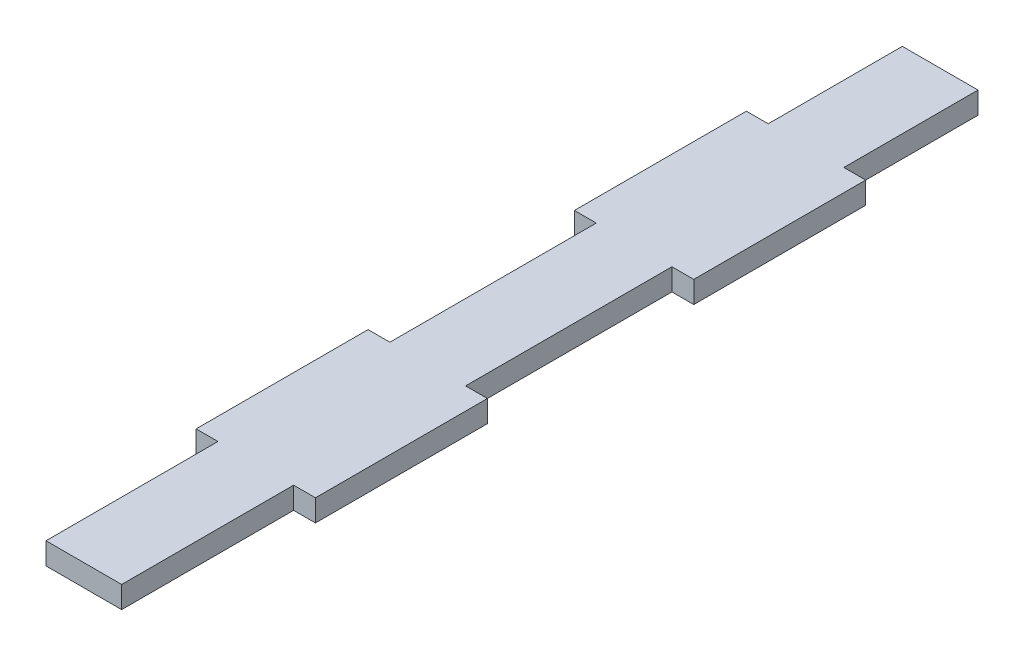
ISO-10303-21;
HEADER;
FILE_DESCRIPTION(('STEP AP214'),'2;1');
FILE_NAME('part.step','',(''),(''),'','','');
FILE_SCHEMA(('AUTOMOTIVE_DESIGN { 1 0 10303 214 1 1 1 1 }'));
ENDSEC;
DATA;
#1=APPLICATION_CONTEXT('core data for automotive mechanical design processes');
#2=APPLICATION_PROTOCOL_DEFINITION('international standard','automotive_design',2000,#1);
#3=PRODUCT_CONTEXT('',#1,'mechanical');
#4=PRODUCT('Part','Part','',(#3));
#5=PRODUCT_RELATED_PRODUCT_CATEGORY('part','',(#4));
#6=PRODUCT_DEFINITION_FORMATION('','',#4);
#7=PRODUCT_DEFINITION_CONTEXT('part definition',#1,'design');
#8=PRODUCT_DEFINITION('design','',#6,#7);
#9=PRODUCT_DEFINITION_SHAPE('','',#8);
#10=(LENGTH_UNIT() NAMED_UNIT(*) SI_UNIT(.MILLI.,.METRE.));
#11=(NAMED_UNIT(*) PLANE_ANGLE_UNIT() SI_UNIT($,.RADIAN.));
#12=(NAMED_UNIT(*) SI_UNIT($,.STERADIAN.) SOLID_ANGLE_UNIT());
#13=UNCERTAINTY_MEASURE_WITH_UNIT(LENGTH_MEASURE(1.E-05),#10,'distance_accuracy_value','');
#14=(GEOMETRIC_REPRESENTATION_CONTEXT(3) GLOBAL_UNCERTAINTY_ASSIGNED_CONTEXT((#13)) GLOBAL_UNIT_ASSIGNED_CONTEXT((#10,
#11,#12)) REPRESENTATION_CONTEXT('',''));
#15=CARTESIAN_POINT('',(0.,0.,0.));
#16=DIRECTION('',(0.,0.,1.));
#17=DIRECTION('',(1.,0.,0.));
#18=AXIS2_PLACEMENT_3D('',#15,#16,#17);
#19=CARTESIAN_POINT('',(0.,6.35,0.));
#20=DIRECTION('',(1.,0.,0.));
#21=DIRECTION('',(0.,0.,-1.));
#22=AXIS2_PLACEMENT_3D('',#19,#20,#21);
#23=PLANE('',#22);
#24=DIRECTION('',(0.,0.,1.));
#25=VECTOR('',#24,1.);
#26=CARTESIAN_POINT('',(0.,0.,0.));
#27=LINE('',#26,#25);
#28=CARTESIAN_POINT('',(0.,0.,-50.));
#29=VERTEX_POINT('',#28);
#30=CARTESIAN_POINT('',(0.,0.,0.));
#31=VERTEX_POINT('',#30);
#32=EDGE_CURVE('E212',#29,#31,#27,.T.);
#33=ORIENTED_EDGE('',*,*,#32,.T.);
#34=DIRECTION('',(0.,-1.,0.));
#35=VECTOR('',#34,1.);
#36=CARTESIAN_POINT('',(0.,6.35,0.));
#37=LINE('',#36,#35);
#38=CARTESIAN_POINT('',(0.,6.35,0.));
#39=VERTEX_POINT('',#38);
#40=EDGE_CURVE('E11',#39,#31,#37,.T.);
#41=ORIENTED_EDGE('',*,*,#40,.F.);
#42=DIRECTION('',(0.,0.,1.));
#43=VECTOR('',#42,1.);
#44=CARTESIAN_POINT('',(0.,6.35,0.));
#45=LINE('',#44,#43);
#46=CARTESIAN_POINT('',(0.,6.35,-50.));
#47=VERTEX_POINT('',#46);
#48=EDGE_CURVE('E270',#47,#39,#45,.T.);
#49=ORIENTED_EDGE('',*,*,#48,.F.);
#50=DIRECTION('',(0.,-1.,0.));
#51=VECTOR('',#50,1.);
#52=CARTESIAN_POINT('',(0.,6.35,-50.));
#53=LINE('',#52,#51);
#54=EDGE_CURVE('E208',#47,#29,#53,.T.);
#55=ORIENTED_EDGE('',*,*,#54,.T.);
#56=EDGE_LOOP('',(#33,#41,#49,#55));
#57=FACE_BOUND('',#56,.T.);
#58=ADVANCED_FACE('F39',(#57),#23,.F.);
#59=CARTESIAN_POINT('',(0.,6.35,0.));
#60=DIRECTION('',(0.,0.,-1.));
#61=DIRECTION('',(-1.,0.,0.));
#62=AXIS2_PLACEMENT_3D('',#59,#60,#61);
#63=PLANE('',#62);
#64=DIRECTION('',(1.,0.,0.));
#65=VECTOR('',#64,1.);
#66=CARTESIAN_POINT('',(0.,0.,0.));
#67=LINE('',#66,#65);
#68=CARTESIAN_POINT('',(22.,0.,0.));
#69=VERTEX_POINT('',#68);
#70=EDGE_CURVE('E216',#31,#69,#67,.T.);
#71=ORIENTED_EDGE('',*,*,#70,.T.);
#72=DIRECTION('',(0.,-1.,0.));
#73=VECTOR('',#72,1.);
#74=CARTESIAN_POINT('',(22.,6.35,0.));
#75=LINE('',#74,#73);
#76=CARTESIAN_POINT('',(22.,6.35,0.));
#77=VERTEX_POINT('',#76);
#78=EDGE_CURVE('E48',#77,#69,#75,.T.);
#79=ORIENTED_EDGE('',*,*,#78,.F.);
#80=DIRECTION('',(1.,0.,0.));
#81=VECTOR('',#80,1.);
#82=CARTESIAN_POINT('',(0.,6.35,0.));
#83=LINE('',#82,#81);
#84=EDGE_CURVE('E135',#39,#77,#83,.T.);
#85=ORIENTED_EDGE('',*,*,#84,.F.);
#86=ORIENTED_EDGE('',*,*,#40,.T.);
#87=EDGE_LOOP('',(#71,#79,#85,#86));
#88=FACE_BOUND('',#87,.T.);
#89=ADVANCED_FACE('F420',(#88),#63,.F.);
#90=CARTESIAN_POINT('',(22.,6.35,0.));
#91=DIRECTION('',(-1.,0.,0.));
#92=DIRECTION('',(0.,0.,1.));
#93=AXIS2_PLACEMENT_3D('',#90,#91,#92);
#94=PLANE('',#93);
#95=DIRECTION('',(0.,0.,-1.));
#96=VECTOR('',#95,1.);
#97=CARTESIAN_POINT('',(22.,0.,0.));
#98=LINE('',#97,#96);
#99=CARTESIAN_POINT('',(22.,0.,-50.));
#100=VERTEX_POINT('',#99);
#101=EDGE_CURVE('E219',#69,#100,#98,.T.);
#102=ORIENTED_EDGE('',*,*,#101,.T.);
#103=DIRECTION('',(0.,-1.,0.));
#104=VECTOR('',#103,1.);
#105=CARTESIAN_POINT('',(22.,6.35,-50.));
#106=LINE('',#105,#104);
#107=CARTESIAN_POINT('',(22.,6.35,-50.));
#108=VERTEX_POINT('',#107);
#109=EDGE_CURVE('E329',#108,#100,#106,.T.);
#110=ORIENTED_EDGE('',*,*,#109,.F.);
#111=DIRECTION('',(0.,0.,-1.));
#112=VECTOR('',#111,1.);
#113=CARTESIAN_POINT('',(22.,6.35,0.));
#114=LINE('',#113,#112);
#115=EDGE_CURVE('E339',#77,#108,#114,.T.);
#116=ORIENTED_EDGE('',*,*,#115,.F.);
#117=ORIENTED_EDGE('',*,*,#78,.T.);
#118=EDGE_LOOP('',(#102,#110,#116,#117));
#119=FACE_BOUND('',#118,.T.);
#120=ADVANCED_FACE('F337',(#119),#94,.F.);
#121=CARTESIAN_POINT('',(22.,6.35,-50.));
#122=DIRECTION('',(0.,0.,-1.));
#123=DIRECTION('',(-1.,0.,0.));
#124=AXIS2_PLACEMENT_3D('',#121,#122,#123);
#125=PLANE('',#124);
#126=DIRECTION('',(1.,0.,0.));
#127=VECTOR('',#126,1.);
#128=CARTESIAN_POINT('',(22.,0.,-50.));
#129=LINE('',#128,#127);
#130=CARTESIAN_POINT('',(28.35,0.,-50.));
#131=VERTEX_POINT('',#130);
#132=EDGE_CURVE('E222',#100,#131,#129,.T.);
#133=ORIENTED_EDGE('',*,*,#132,.T.);
#134=DIRECTION('',(0.,-1.,0.));
#135=VECTOR('',#134,1.);
#136=CARTESIAN_POINT('',(28.35,6.35,-50.));
#137=LINE('',#136,#135);
#138=CARTESIAN_POINT('',(28.35,6.35,-50.));
#139=VERTEX_POINT('',#138);
#140=EDGE_CURVE('E325',#139,#131,#137,.T.);
#141=ORIENTED_EDGE('',*,*,#140,.F.);
#142=DIRECTION('',(1.,0.,0.));
#143=VECTOR('',#142,1.);
#144=CARTESIAN_POINT('',(22.,6.35,-50.));
#145=LINE('',#144,#143);
#146=EDGE_CURVE('E358',#108,#139,#145,.T.);
#147=ORIENTED_EDGE('',*,*,#146,.F.);
#148=ORIENTED_EDGE('',*,*,#109,.T.);
#149=EDGE_LOOP('',(#133,#141,#147,#148));
#150=FACE_BOUND('',#149,.T.);
#151=ADVANCED_FACE('F348',(#150),#125,.F.);
#152=CARTESIAN_POINT('',(28.35,6.35,-50.));
#153=DIRECTION('',(-1.,0.,0.));
#154=DIRECTION('',(0.,0.,1.));
#155=AXIS2_PLACEMENT_3D('',#152,#153,#154);
#156=PLANE('',#155);
#157=DIRECTION('',(0.,0.,-1.));
#158=VECTOR('',#157,1.);
#159=CARTESIAN_POINT('',(28.35,0.,-50.));
#160=LINE('',#159,#158);
#161=CARTESIAN_POINT('',(28.35,0.,-100.));
#162=VERTEX_POINT('',#161);
#163=EDGE_CURVE('E225',#131,#162,#160,.T.);
#164=ORIENTED_EDGE('',*,*,#163,.T.);
#165=DIRECTION('',(0.,-1.,0.));
#166=VECTOR('',#165,1.);
#167=CARTESIAN_POINT('',(28.35,6.35,-100.));
#168=LINE('',#167,#166);
#169=CARTESIAN_POINT('',(28.35,6.35,-100.));
#170=VERTEX_POINT('',#169);
#171=EDGE_CURVE('E321',#170,#162,#168,.T.);
#172=ORIENTED_EDGE('',*,*,#171,.F.);
#173=DIRECTION('',(0.,0.,-1.));
#174=VECTOR('',#173,1.);
#175=CARTESIAN_POINT('',(28.35,6.35,-50.));
#176=LINE('',#175,#174);
#177=EDGE_CURVE('E354',#139,#170,#176,.T.);
#178=ORIENTED_EDGE('',*,*,#177,.F.);
#179=ORIENTED_EDGE('',*,*,#140,.T.);
#180=EDGE_LOOP('',(#164,#172,#178,#179));
#181=FACE_BOUND('',#180,.T.);
#182=ADVANCED_FACE('F352',(#181),#156,.F.);
#183=CARTESIAN_POINT('',(22.,6.35,-100.));
#184=DIRECTION('',(0.,0.,1.));
#185=DIRECTION('',(1.,0.,0.));
#186=AXIS2_PLACEMENT_3D('',#183,#184,#185);
#187=PLANE('',#186);
#188=DIRECTION('',(-1.,0.,0.));
#189=VECTOR('',#188,1.);
#190=CARTESIAN_POINT('',(22.,0.,-100.));
#191=LINE('',#190,#189);
#192=CARTESIAN_POINT('',(22.,0.,-100.));
#193=VERTEX_POINT('',#192);
#194=EDGE_CURVE('E228',#162,#193,#191,.T.);
#195=ORIENTED_EDGE('',*,*,#194,.T.);
#196=DIRECTION('',(0.,-1.,0.));
#197=VECTOR('',#196,1.);
#198=CARTESIAN_POINT('',(22.,6.35,-100.));
#199=LINE('',#198,#197);
#200=CARTESIAN_POINT('',(22.,6.35,-100.));
#201=VERTEX_POINT('',#200);
#202=EDGE_CURVE('E317',#201,#193,#199,.T.);
#203=ORIENTED_EDGE('',*,*,#202,.F.);
#204=DIRECTION('',(-1.,0.,0.));
#205=VECTOR('',#204,1.);
#206=CARTESIAN_POINT('',(22.,6.35,-100.));
#207=LINE('',#206,#205);
#208=EDGE_CURVE('E357',#170,#201,#207,.T.);
#209=ORIENTED_EDGE('',*,*,#208,.F.);
#210=ORIENTED_EDGE('',*,*,#171,.T.);
#211=EDGE_LOOP('',(#195,#203,#209,#210));
#212=FACE_BOUND('',#211,.T.);
#213=ADVANCED_FACE('F433',(#212),#187,.F.);
#214=CARTESIAN_POINT('',(22.,6.35,-100.));
#215=DIRECTION('',(-1.,0.,0.));
#216=DIRECTION('',(0.,0.,1.));
#217=AXIS2_PLACEMENT_3D('',#214,#215,#216);
#218=PLANE('',#217);
#219=DIRECTION('',(0.,0.,-1.));
#220=VECTOR('',#219,1.);
#221=CARTESIAN_POINT('',(22.,0.,-100.));
#222=LINE('',#221,#220);
#223=CARTESIAN_POINT('',(22.,0.,-160.));
#224=VERTEX_POINT('',#223);
#225=EDGE_CURVE('E231',#193,#224,#222,.T.);
#226=ORIENTED_EDGE('',*,*,#225,.T.);
#227=DIRECTION('',(0.,-1.,0.));
#228=VECTOR('',#227,1.);
#229=CARTESIAN_POINT('',(22.,6.35,-160.));
#230=LINE('',#229,#228);
#231=CARTESIAN_POINT('',(22.,6.35,-160.));
#232=VERTEX_POINT('',#231);
#233=EDGE_CURVE('E313',#232,#224,#230,.T.);
#234=ORIENTED_EDGE('',*,*,#233,.F.);
#235=DIRECTION('',(0.,0.,-1.));
#236=VECTOR('',#235,1.);
#237=CARTESIAN_POINT('',(22.,6.35,-100.));
#238=LINE('',#237,#236);
#239=EDGE_CURVE('E362',#201,#232,#238,.T.);
#240=ORIENTED_EDGE('',*,*,#239,.F.);
#241=ORIENTED_EDGE('',*,*,#202,.T.);
#242=EDGE_LOOP('',(#226,#234,#240,#241));
#243=FACE_BOUND('',#242,.T.);
#244=ADVANCED_FACE('F436',(#243),#218,.F.);
#245=CARTESIAN_POINT('',(22.,6.35,-160.));
#246=DIRECTION('',(0.,0.,-1.));
#247=DIRECTION('',(-1.,0.,0.));
#248=AXIS2_PLACEMENT_3D('',#245,#246,#247);
#249=PLANE('',#248);
#250=DIRECTION('',(1.,0.,0.));
#251=VECTOR('',#250,1.);
#252=CARTESIAN_POINT('',(22.,0.,-160.));
#253=LINE('',#252,#251);
#254=CARTESIAN_POINT('',(28.35,0.,-160.));
#255=VERTEX_POINT('',#254);
#256=EDGE_CURVE('E234',#224,#255,#253,.T.);
#257=ORIENTED_EDGE('',*,*,#256,.T.);
#258=DIRECTION('',(0.,-1.,0.));
#259=VECTOR('',#258,1.);
#260=CARTESIAN_POINT('',(28.35,6.35,-160.));
#261=LINE('',#260,#259);
#262=CARTESIAN_POINT('',(28.35,6.35,-160.));
#263=VERTEX_POINT('',#262);
#264=EDGE_CURVE('E309',#263,#255,#261,.T.);
#265=ORIENTED_EDGE('',*,*,#264,.F.);
#266=DIRECTION('',(1.,0.,0.));
#267=VECTOR('',#266,1.);
#268=CARTESIAN_POINT('',(22.,6.35,-160.));
#269=LINE('',#268,#267);
#270=EDGE_CURVE('E369',#232,#263,#269,.T.);
#271=ORIENTED_EDGE('',*,*,#270,.F.);
#272=ORIENTED_EDGE('',*,*,#233,.T.);
#273=EDGE_LOOP('',(#257,#265,#271,#272));
#274=FACE_BOUND('',#273,.T.);
#275=ADVANCED_FACE('F440',(#274),#249,.F.);
#276=CARTESIAN_POINT('',(28.35,6.35,-160.));
#277=DIRECTION('',(-1.,0.,0.));
#278=DIRECTION('',(0.,0.,1.));
#279=AXIS2_PLACEMENT_3D('',#276,#277,#278);
#280=PLANE('',#279);
#281=DIRECTION('',(0.,0.,-1.));
#282=VECTOR('',#281,1.);
#283=CARTESIAN_POINT('',(28.35,0.,-160.));
#284=LINE('',#283,#282);
#285=CARTESIAN_POINT('',(28.35,0.,-210.));
#286=VERTEX_POINT('',#285);
#287=EDGE_CURVE('E237',#255,#286,#284,.T.);
#288=ORIENTED_EDGE('',*,*,#287,.T.);
#289=DIRECTION('',(0.,-1.,0.));
#290=VECTOR('',#289,1.);
#291=CARTESIAN_POINT('',(28.35,6.35,-210.));
#292=LINE('',#291,#290);
#293=CARTESIAN_POINT('',(28.35,6.35,-210.));
#294=VERTEX_POINT('',#293);
#295=EDGE_CURVE('E305',#294,#286,#292,.T.);
#296=ORIENTED_EDGE('',*,*,#295,.F.);
#297=DIRECTION('',(0.,0.,-1.));
#298=VECTOR('',#297,1.);
#299=CARTESIAN_POINT('',(28.35,6.35,-160.));
#300=LINE('',#299,#298);
#301=EDGE_CURVE('E372',#263,#294,#300,.T.);
#302=ORIENTED_EDGE('',*,*,#301,.F.);
#303=ORIENTED_EDGE('',*,*,#264,.T.);
#304=EDGE_LOOP('',(#288,#296,#302,#303));
#305=FACE_BOUND('',#304,.T.);
#306=ADVANCED_FACE('F444',(#305),#280,.F.);
#307=CARTESIAN_POINT('',(22.,6.35,-210.));
#308=DIRECTION('',(0.,0.,1.));
#309=DIRECTION('',(1.,0.,0.));
#310=AXIS2_PLACEMENT_3D('',#307,#308,#309);
#311=PLANE('',#310);
#312=DIRECTION('',(-1.,0.,0.));
#313=VECTOR('',#312,1.);
#314=CARTESIAN_POINT('',(22.,0.,-210.));
#315=LINE('',#314,#313);
#316=CARTESIAN_POINT('',(22.,0.,-210.));
#317=VERTEX_POINT('',#316);
#318=EDGE_CURVE('E240',#286,#317,#315,.T.);
#319=ORIENTED_EDGE('',*,*,#318,.T.);
#320=DIRECTION('',(0.,-1.,0.));
#321=VECTOR('',#320,1.);
#322=CARTESIAN_POINT('',(22.,6.35,-210.));
#323=LINE('',#322,#321);
#324=CARTESIAN_POINT('',(22.,6.35,-210.));
#325=VERTEX_POINT('',#324);
#326=EDGE_CURVE('E301',#325,#317,#323,.T.);
#327=ORIENTED_EDGE('',*,*,#326,.F.);
#328=DIRECTION('',(-1.,0.,0.));
#329=VECTOR('',#328,1.);
#330=CARTESIAN_POINT('',(22.,6.35,-210.));
#331=LINE('',#330,#329);
#332=EDGE_CURVE('E375',#294,#325,#331,.T.);
#333=ORIENTED_EDGE('',*,*,#332,.F.);
#334=ORIENTED_EDGE('',*,*,#295,.T.);
#335=EDGE_LOOP('',(#319,#327,#333,#334));
#336=FACE_BOUND('',#335,.T.);
#337=ADVANCED_FACE('F448',(#336),#311,.F.);
#338=CARTESIAN_POINT('',(22.,6.35,-210.));
#339=DIRECTION('',(-1.,0.,0.));
#340=DIRECTION('',(0.,0.,1.));
#341=AXIS2_PLACEMENT_3D('',#338,#339,#340);
#342=PLANE('',#341);
#343=DIRECTION('',(0.,0.,-1.));
#344=VECTOR('',#343,1.);
#345=CARTESIAN_POINT('',(22.,0.,-210.));
#346=LINE('',#345,#344);
#347=CARTESIAN_POINT('',(22.,0.,-249.));
#348=VERTEX_POINT('',#347);
#349=EDGE_CURVE('E243',#317,#348,#346,.T.);
#350=ORIENTED_EDGE('',*,*,#349,.T.);
#351=DIRECTION('',(0.,-1.,0.));
#352=VECTOR('',#351,1.);
#353=CARTESIAN_POINT('',(22.,6.35,-249.));
#354=LINE('',#353,#352);
#355=CARTESIAN_POINT('',(22.,6.35,-249.));
#356=VERTEX_POINT('',#355);
#357=EDGE_CURVE('E297',#356,#348,#354,.T.);
#358=ORIENTED_EDGE('',*,*,#357,.F.);
#359=DIRECTION('',(0.,0.,-1.));
#360=VECTOR('',#359,1.);
#361=CARTESIAN_POINT('',(22.,6.35,-210.));
#362=LINE('',#361,#360);
#363=EDGE_CURVE('E378',#325,#356,#362,.T.);
#364=ORIENTED_EDGE('',*,*,#363,.F.);
#365=ORIENTED_EDGE('',*,*,#326,.T.);
#366=EDGE_LOOP('',(#350,#358,#364,#365));
#367=FACE_BOUND('',#366,.T.);
#368=ADVANCED_FACE('F452',(#367),#342,.F.);
#369=CARTESIAN_POINT('',(0.,6.35,-249.));
#370=DIRECTION('',(0.,0.,1.));
#371=DIRECTION('',(1.,0.,0.));
#372=AXIS2_PLACEMENT_3D('',#369,#370,#371);
#373=PLANE('',#372);
#374=DIRECTION('',(-1.,0.,0.));
#375=VECTOR('',#374,1.);
#376=CARTESIAN_POINT('',(0.,0.,-249.));
#377=LINE('',#376,#375);
#378=CARTESIAN_POINT('',(0.,0.,-249.));
#379=VERTEX_POINT('',#378);
#380=EDGE_CURVE('E246',#348,#379,#377,.T.);
#381=ORIENTED_EDGE('',*,*,#380,.T.);
#382=DIRECTION('',(0.,-1.,0.));
#383=VECTOR('',#382,1.);
#384=CARTESIAN_POINT('',(0.,6.35,-249.));
#385=LINE('',#384,#383);
#386=CARTESIAN_POINT('',(0.,6.35,-249.));
#387=VERTEX_POINT('',#386);
#388=EDGE_CURVE('E293',#387,#379,#385,.T.);
#389=ORIENTED_EDGE('',*,*,#388,.F.);
#390=DIRECTION('',(-1.,0.,0.));
#391=VECTOR('',#390,1.);
#392=CARTESIAN_POINT('',(0.,6.35,-249.));
#393=LINE('',#392,#391);
#394=EDGE_CURVE('E381',#356,#387,#393,.T.);
#395=ORIENTED_EDGE('',*,*,#394,.F.);
#396=ORIENTED_EDGE('',*,*,#357,.T.);
#397=EDGE_LOOP('',(#381,#389,#395,#396));
#398=FACE_BOUND('',#397,.T.);
#399=ADVANCED_FACE('F456',(#398),#373,.F.);
#400=CARTESIAN_POINT('',(0.,6.35,-210.));
#401=DIRECTION('',(1.,0.,0.));
#402=DIRECTION('',(0.,0.,-1.));
#403=AXIS2_PLACEMENT_3D('',#400,#401,#402);
#404=PLANE('',#403);
#405=DIRECTION('',(0.,0.,1.));
#406=VECTOR('',#405,1.);
#407=CARTESIAN_POINT('',(0.,0.,-210.));
#408=LINE('',#407,#406);
#409=CARTESIAN_POINT('',(0.,0.,-210.));
#410=VERTEX_POINT('',#409);
#411=EDGE_CURVE('E249',#379,#410,#408,.T.);
#412=ORIENTED_EDGE('',*,*,#411,.T.);
#413=DIRECTION('',(0.,-1.,0.));
#414=VECTOR('',#413,1.);
#415=CARTESIAN_POINT('',(0.,6.35,-210.));
#416=LINE('',#415,#414);
#417=CARTESIAN_POINT('',(0.,6.35,-210.));
#418=VERTEX_POINT('',#417);
#419=EDGE_CURVE('E289',#418,#410,#416,.T.);
#420=ORIENTED_EDGE('',*,*,#419,.F.);
#421=DIRECTION('',(0.,0.,1.));
#422=VECTOR('',#421,1.);
#423=CARTESIAN_POINT('',(0.,6.35,-210.));
#424=LINE('',#423,#422);
#425=EDGE_CURVE('E384',#387,#418,#424,.T.);
#426=ORIENTED_EDGE('',*,*,#425,.F.);
#427=ORIENTED_EDGE('',*,*,#388,.T.);
#428=EDGE_LOOP('',(#412,#420,#426,#427));
#429=FACE_BOUND('',#428,.T.);
#430=ADVANCED_FACE('F460',(#429),#404,.F.);
#431=CARTESIAN_POINT('',(0.,6.35,-210.));
#432=DIRECTION('',(0.,0.,1.));
#433=DIRECTION('',(1.,0.,0.));
#434=AXIS2_PLACEMENT_3D('',#431,#432,#433);
#435=PLANE('',#434);
#436=DIRECTION('',(-1.,0.,0.));
#437=VECTOR('',#436,1.);
#438=CARTESIAN_POINT('',(0.,0.,-210.));
#439=LINE('',#438,#437);
#440=CARTESIAN_POINT('',(-6.35,0.,-210.));
#441=VERTEX_POINT('',#440);
#442=EDGE_CURVE('E252',#410,#441,#439,.T.);
#443=ORIENTED_EDGE('',*,*,#442,.T.);
#444=DIRECTION('',(0.,-1.,0.));
#445=VECTOR('',#444,1.);
#446=CARTESIAN_POINT('',(-6.35,6.35,-210.));
#447=LINE('',#446,#445);
#448=CARTESIAN_POINT('',(-6.35,6.35,-210.));
#449=VERTEX_POINT('',#448);
#450=EDGE_CURVE('E285',#449,#441,#447,.T.);
#451=ORIENTED_EDGE('',*,*,#450,.F.);
#452=DIRECTION('',(-1.,0.,0.));
#453=VECTOR('',#452,1.);
#454=CARTESIAN_POINT('',(0.,6.35,-210.));
#455=LINE('',#454,#453);
#456=EDGE_CURVE('E387',#418,#449,#455,.T.);
#457=ORIENTED_EDGE('',*,*,#456,.F.);
#458=ORIENTED_EDGE('',*,*,#419,.T.);
#459=EDGE_LOOP('',(#443,#451,#457,#458));
#460=FACE_BOUND('',#459,.T.);
#461=ADVANCED_FACE('F464',(#460),#435,.F.);
#462=CARTESIAN_POINT('',(-6.35,6.35,-160.));
#463=DIRECTION('',(1.,0.,0.));
#464=DIRECTION('',(0.,0.,-1.));
#465=AXIS2_PLACEMENT_3D('',#462,#463,#464);
#466=PLANE('',#465);
#467=DIRECTION('',(0.,0.,1.));
#468=VECTOR('',#467,1.);
#469=CARTESIAN_POINT('',(-6.35,0.,-160.));
#470=LINE('',#469,#468);
#471=CARTESIAN_POINT('',(-6.35,0.,-160.));
#472=VERTEX_POINT('',#471);
#473=EDGE_CURVE('E255',#441,#472,#470,.T.);
#474=ORIENTED_EDGE('',*,*,#473,.T.);
#475=DIRECTION('',(0.,-1.,0.));
#476=VECTOR('',#475,1.);
#477=CARTESIAN_POINT('',(-6.35,6.35,-160.));
#478=LINE('',#477,#476);
#479=CARTESIAN_POINT('',(-6.35,6.35,-160.));
#480=VERTEX_POINT('',#479);
#481=EDGE_CURVE('E281',#480,#472,#478,.T.);
#482=ORIENTED_EDGE('',*,*,#481,.F.);
#483=DIRECTION('',(0.,0.,1.));
#484=VECTOR('',#483,1.);
#485=CARTESIAN_POINT('',(-6.35,6.35,-160.));
#486=LINE('',#485,#484);
#487=EDGE_CURVE('E390',#449,#480,#486,.T.);
#488=ORIENTED_EDGE('',*,*,#487,.F.);
#489=ORIENTED_EDGE('',*,*,#450,.T.);
#490=EDGE_LOOP('',(#474,#482,#488,#489));
#491=FACE_BOUND('',#490,.T.);
#492=ADVANCED_FACE('F468',(#491),#466,.F.);
#493=CARTESIAN_POINT('',(0.,6.35,-160.));
#494=DIRECTION('',(0.,0.,-1.));
#495=DIRECTION('',(-1.,0.,0.));
#496=AXIS2_PLACEMENT_3D('',#493,#494,#495);
#497=PLANE('',#496);
#498=DIRECTION('',(1.,0.,0.));
#499=VECTOR('',#498,1.);
#500=CARTESIAN_POINT('',(0.,0.,-160.));
#501=LINE('',#500,#499);
#502=CARTESIAN_POINT('',(0.,0.,-160.));
#503=VERTEX_POINT('',#502);
#504=EDGE_CURVE('E258',#472,#503,#501,.T.);
#505=ORIENTED_EDGE('',*,*,#504,.T.);
#506=DIRECTION('',(0.,-1.,0.));
#507=VECTOR('',#506,1.);
#508=CARTESIAN_POINT('',(0.,6.35,-160.));
#509=LINE('',#508,#507);
#510=CARTESIAN_POINT('',(0.,6.35,-160.));
#511=VERTEX_POINT('',#510);
#512=EDGE_CURVE('E277',#511,#503,#509,.T.);
#513=ORIENTED_EDGE('',*,*,#512,.F.);
#514=DIRECTION('',(1.,0.,0.));
#515=VECTOR('',#514,1.);
#516=CARTESIAN_POINT('',(0.,6.35,-160.));
#517=LINE('',#516,#515);
#518=EDGE_CURVE('E393',#480,#511,#517,.T.);
#519=ORIENTED_EDGE('',*,*,#518,.F.);
#520=ORIENTED_EDGE('',*,*,#481,.T.);
#521=EDGE_LOOP('',(#505,#513,#519,#520));
#522=FACE_BOUND('',#521,.T.);
#523=ADVANCED_FACE('F401',(#522),#497,.F.);
#524=CARTESIAN_POINT('',(0.,6.35,-100.));
#525=DIRECTION('',(1.,0.,0.));
#526=DIRECTION('',(0.,0.,-1.));
#527=AXIS2_PLACEMENT_3D('',#524,#525,#526);
#528=PLANE('',#527);
#529=DIRECTION('',(0.,0.,1.));
#530=VECTOR('',#529,1.);
#531=CARTESIAN_POINT('',(0.,0.,-100.));
#532=LINE('',#531,#530);
#533=CARTESIAN_POINT('',(0.,0.,-100.));
#534=VERTEX_POINT('',#533);
#535=EDGE_CURVE('E261',#503,#534,#532,.T.);
#536=ORIENTED_EDGE('',*,*,#535,.T.);
#537=DIRECTION('',(0.,-1.,0.));
#538=VECTOR('',#537,1.);
#539=CARTESIAN_POINT('',(0.,6.35,-100.));
#540=LINE('',#539,#538);
#541=CARTESIAN_POINT('',(0.,6.35,-100.));
#542=VERTEX_POINT('',#541);
#543=EDGE_CURVE('E201',#542,#534,#540,.T.);
#544=ORIENTED_EDGE('',*,*,#543,.F.);
#545=DIRECTION('',(0.,0.,1.));
#546=VECTOR('',#545,1.);
#547=CARTESIAN_POINT('',(0.,6.35,-100.));
#548=LINE('',#547,#546);
#549=EDGE_CURVE('E190',#511,#542,#548,.T.);
#550=ORIENTED_EDGE('',*,*,#549,.F.);
#551=ORIENTED_EDGE('',*,*,#512,.T.);
#552=EDGE_LOOP('',(#536,#544,#550,#551));
#553=FACE_BOUND('',#552,.T.);
#554=ADVANCED_FACE('F405',(#553),#528,.F.);
#555=CARTESIAN_POINT('',(0.,6.35,-100.));
#556=DIRECTION('',(0.,0.,1.));
#557=DIRECTION('',(1.,0.,0.));
#558=AXIS2_PLACEMENT_3D('',#555,#556,#557);
#559=PLANE('',#558);
#560=DIRECTION('',(-1.,0.,0.));
#561=VECTOR('',#560,1.);
#562=CARTESIAN_POINT('',(0.,0.,-100.));
#563=LINE('',#562,#561);
#564=CARTESIAN_POINT('',(-6.35,0.,-100.));
#565=VERTEX_POINT('',#564);
#566=EDGE_CURVE('E199',#534,#565,#563,.T.);
#567=ORIENTED_EDGE('',*,*,#566,.T.);
#568=DIRECTION('',(0.,-1.,0.));
#569=VECTOR('',#568,1.);
#570=CARTESIAN_POINT('',(-6.35,6.35,-100.));
#571=LINE('',#570,#569);
#572=CARTESIAN_POINT('',(-6.35,6.35,-100.));
#573=VERTEX_POINT('',#572);
#574=EDGE_CURVE('E196',#573,#565,#571,.T.);
#575=ORIENTED_EDGE('',*,*,#574,.F.);
#576=DIRECTION('',(-1.,0.,0.));
#577=VECTOR('',#576,1.);
#578=CARTESIAN_POINT('',(0.,6.35,-100.));
#579=LINE('',#578,#577);
#580=EDGE_CURVE('E184',#542,#573,#579,.T.);
#581=ORIENTED_EDGE('',*,*,#580,.F.);
#582=ORIENTED_EDGE('',*,*,#543,.T.);
#583=EDGE_LOOP('',(#567,#575,#581,#582));
#584=FACE_BOUND('',#583,.T.);
#585=ADVANCED_FACE('F197',(#584),#559,.F.);
#586=CARTESIAN_POINT('',(-6.35,6.35,-50.));
#587=DIRECTION('',(1.,0.,0.));
#588=DIRECTION('',(0.,0.,-1.));
#589=AXIS2_PLACEMENT_3D('',#586,#587,#588);
#590=PLANE('',#589);
#591=DIRECTION('',(0.,0.,1.));
#592=VECTOR('',#591,1.);
#593=CARTESIAN_POINT('',(-6.35,0.,-50.));
#594=LINE('',#593,#592);
#595=CARTESIAN_POINT('',(-6.35,0.,-50.));
#596=VERTEX_POINT('',#595);
#597=EDGE_CURVE('E121',#565,#596,#594,.T.);
#598=ORIENTED_EDGE('',*,*,#597,.T.);
#599=DIRECTION('',(0.,-1.,0.));
#600=VECTOR('',#599,1.);
#601=CARTESIAN_POINT('',(-6.35,6.35,-50.));
#602=LINE('',#601,#600);
#603=CARTESIAN_POINT('',(-6.35,6.35,-50.));
#604=VERTEX_POINT('',#603);
#605=EDGE_CURVE('E202',#604,#596,#602,.T.);
#606=ORIENTED_EDGE('',*,*,#605,.F.);
#607=DIRECTION('',(0.,0.,1.));
#608=VECTOR('',#607,1.);
#609=CARTESIAN_POINT('',(-6.35,6.35,-50.));
#610=LINE('',#609,#608);
#611=EDGE_CURVE('E188',#573,#604,#610,.T.);
#612=ORIENTED_EDGE('',*,*,#611,.F.);
#613=ORIENTED_EDGE('',*,*,#574,.T.);
#614=EDGE_LOOP('',(#598,#606,#612,#613));
#615=FACE_BOUND('',#614,.T.);
#616=ADVANCED_FACE('F204',(#615),#590,.F.);
#617=CARTESIAN_POINT('',(0.,6.35,-50.));
#618=DIRECTION('',(0.,0.,-1.));
#619=DIRECTION('',(-1.,0.,0.));
#620=AXIS2_PLACEMENT_3D('',#617,#618,#619);
#621=PLANE('',#620);
#622=DIRECTION('',(1.,0.,0.));
#623=VECTOR('',#622,1.);
#624=CARTESIAN_POINT('',(0.,0.,-50.));
#625=LINE('',#624,#623);
#626=EDGE_CURVE('E127',#596,#29,#625,.T.);
#627=ORIENTED_EDGE('',*,*,#626,.T.);
#628=ORIENTED_EDGE('',*,*,#54,.F.);
#629=DIRECTION('',(1.,0.,0.));
#630=VECTOR('',#629,1.);
#631=CARTESIAN_POINT('',(0.,6.35,-50.));
#632=LINE('',#631,#630);
#633=EDGE_CURVE('E56',#604,#47,#632,.T.);
#634=ORIENTED_EDGE('',*,*,#633,.F.);
#635=ORIENTED_EDGE('',*,*,#605,.T.);
#636=EDGE_LOOP('',(#627,#628,#634,#635));
#637=FACE_BOUND('',#636,.T.);
#638=ADVANCED_FACE('F409',(#637),#621,.F.);
#639=CARTESIAN_POINT('',(0.,6.35,0.));
#640=DIRECTION('',(0.,1.,0.));
#641=DIRECTION('',(0.,0.,1.));
#642=AXIS2_PLACEMENT_3D('',#639,#640,#641);
#643=PLANE('',#642);
#644=ORIENTED_EDGE('',*,*,#48,.T.);
#645=ORIENTED_EDGE('',*,*,#84,.T.);
#646=ORIENTED_EDGE('',*,*,#115,.T.);
#647=ORIENTED_EDGE('',*,*,#146,.T.);
#648=ORIENTED_EDGE('',*,*,#177,.T.);
#649=ORIENTED_EDGE('',*,*,#208,.T.);
#650=ORIENTED_EDGE('',*,*,#239,.T.);
#651=ORIENTED_EDGE('',*,*,#270,.T.);
#652=ORIENTED_EDGE('',*,*,#301,.T.);
#653=ORIENTED_EDGE('',*,*,#332,.T.);
#654=ORIENTED_EDGE('',*,*,#363,.T.);
#655=ORIENTED_EDGE('',*,*,#394,.T.);
#656=ORIENTED_EDGE('',*,*,#425,.T.);
#657=ORIENTED_EDGE('',*,*,#456,.T.);
#658=ORIENTED_EDGE('',*,*,#487,.T.);
#659=ORIENTED_EDGE('',*,*,#518,.T.);
#660=ORIENTED_EDGE('',*,*,#549,.T.);
#661=ORIENTED_EDGE('',*,*,#580,.T.);
#662=ORIENTED_EDGE('',*,*,#611,.T.);
#663=ORIENTED_EDGE('',*,*,#633,.T.);
#664=EDGE_LOOP('',(#644,#645,#646,#647,#648,#649,#650,#651,#652,#653,#654,#655,#656,#657,#658,
#659,#660,#661,#662,#663));
#665=FACE_BOUND('',#664,.T.);
#666=ADVANCED_FACE('F186',(#665),#643,.T.);
#667=CARTESIAN_POINT('',(0.,0.,0.));
#668=DIRECTION('',(0.,1.,0.));
#669=DIRECTION('',(0.,0.,1.));
#670=AXIS2_PLACEMENT_3D('',#667,#668,#669);
#671=PLANE('',#670);
#672=ORIENTED_EDGE('',*,*,#32,.F.);
#673=ORIENTED_EDGE('',*,*,#626,.F.);
#674=ORIENTED_EDGE('',*,*,#597,.F.);
#675=ORIENTED_EDGE('',*,*,#566,.F.);
#676=ORIENTED_EDGE('',*,*,#535,.F.);
#677=ORIENTED_EDGE('',*,*,#504,.F.);
#678=ORIENTED_EDGE('',*,*,#473,.F.);
#679=ORIENTED_EDGE('',*,*,#442,.F.);
#680=ORIENTED_EDGE('',*,*,#411,.F.);
#681=ORIENTED_EDGE('',*,*,#380,.F.);
#682=ORIENTED_EDGE('',*,*,#349,.F.);
#683=ORIENTED_EDGE('',*,*,#318,.F.);
#684=ORIENTED_EDGE('',*,*,#287,.F.);
#685=ORIENTED_EDGE('',*,*,#256,.F.);
#686=ORIENTED_EDGE('',*,*,#225,.F.);
#687=ORIENTED_EDGE('',*,*,#194,.F.);
#688=ORIENTED_EDGE('',*,*,#163,.F.);
#689=ORIENTED_EDGE('',*,*,#132,.F.);
#690=ORIENTED_EDGE('',*,*,#101,.F.);
#691=ORIENTED_EDGE('',*,*,#70,.F.);
#692=EDGE_LOOP('',(#672,#673,#674,#675,#676,#677,#678,#679,#680,#681,#682,#683,#684,#685,#686,
#687,#688,#689,#690,#691));
#693=FACE_BOUND('',#692,.T.);
#694=ADVANCED_FACE('F343',(#693),#671,.F.);
#695=CLOSED_SHELL('',(#58,#89,#120,#151,#182,#213,#244,#275,#306,#337,#368,#399,#430,#461,#492,
#523,#554,#585,#616,#638,#666,#694));
#696=MANIFOLD_SOLID_BREP('B2',#695);
#697=ADVANCED_BREP_SHAPE_REPRESENTATION('',(#18,#696),#14);
#698=SHAPE_DEFINITION_REPRESENTATION(#9,#697);
ENDSEC;
END-ISO-10303-21;
